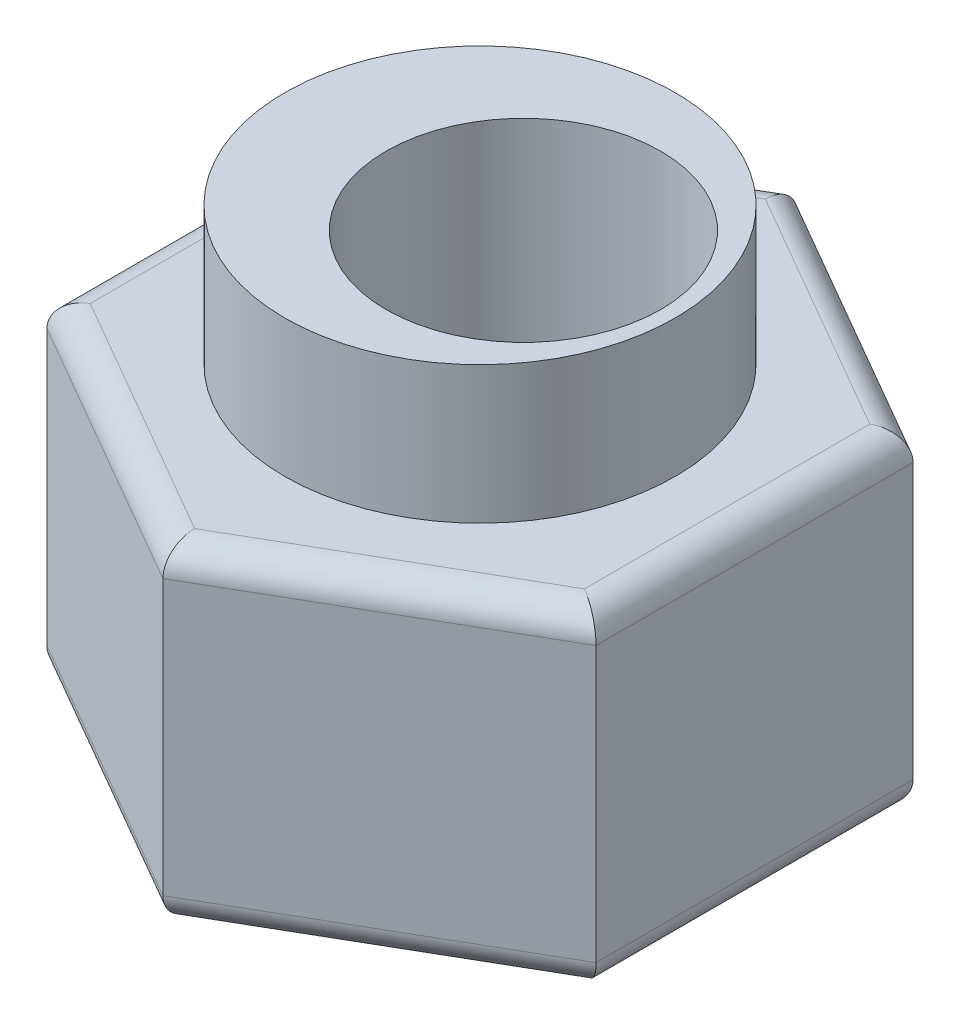
ISO-10303-21;
HEADER;
FILE_DESCRIPTION(('STEP AP214'),'2;1');
FILE_NAME('part.step','',(''),(''),'','','');
FILE_SCHEMA(('AUTOMOTIVE_DESIGN { 1 0 10303 214 1 1 1 1 }'));
ENDSEC;
DATA;
#1=APPLICATION_CONTEXT('core data for automotive mechanical design processes');
#2=APPLICATION_PROTOCOL_DEFINITION('international standard','automotive_design',2000,#1);
#3=PRODUCT_CONTEXT('',#1,'mechanical');
#4=PRODUCT('Part','Part','',(#3));
#5=PRODUCT_RELATED_PRODUCT_CATEGORY('part','',(#4));
#6=PRODUCT_DEFINITION_FORMATION('','',#4);
#7=PRODUCT_DEFINITION_CONTEXT('part definition',#1,'design');
#8=PRODUCT_DEFINITION('design','',#6,#7);
#9=PRODUCT_DEFINITION_SHAPE('','',#8);
#10=(LENGTH_UNIT() NAMED_UNIT(*) SI_UNIT(.MILLI.,.METRE.));
#11=(NAMED_UNIT(*) PLANE_ANGLE_UNIT() SI_UNIT($,.RADIAN.));
#12=(NAMED_UNIT(*) SI_UNIT($,.STERADIAN.) SOLID_ANGLE_UNIT());
#13=UNCERTAINTY_MEASURE_WITH_UNIT(LENGTH_MEASURE(1.E-05),#10,'distance_accuracy_value','');
#14=(GEOMETRIC_REPRESENTATION_CONTEXT(3) GLOBAL_UNCERTAINTY_ASSIGNED_CONTEXT((#13)) GLOBAL_UNIT_ASSIGNED_CONTEXT((#10,
#11,#12)) REPRESENTATION_CONTEXT('',''));
#15=CARTESIAN_POINT('',(0.,0.,0.));
#16=DIRECTION('',(0.,0.,1.));
#17=DIRECTION('',(1.,0.,0.));
#18=AXIS2_PLACEMENT_3D('',#15,#16,#17);
#19=CARTESIAN_POINT('',(0.,6.,5.77350269189626));
#20=DIRECTION('',(-0.5,0.,-0.866025403784439));
#21=DIRECTION('',(-0.866025403784439,0.,0.5));
#22=AXIS2_PLACEMENT_3D('',#19,#20,#21);
#23=PLANE('',#22);
#24=DIRECTION('',(0.,-1.,0.));
#25=VECTOR('',#24,1.);
#26=CARTESIAN_POINT('',(0.,6.,5.77350269189626));
#27=LINE('',#26,#25);
#28=CARTESIAN_POINT('',(0.,5.5,5.77350269189626));
#29=VERTEX_POINT('',#28);
#30=CARTESIAN_POINT('',(0.,0.5,5.77350269189626));
#31=VERTEX_POINT('',#30);
#32=EDGE_CURVE('E166',#29,#31,#27,.T.);
#33=ORIENTED_EDGE('',*,*,#32,.T.);
#34=DIRECTION('',(0.866025403784439,0.,-0.5));
#35=VECTOR('',#34,1.);
#36=CARTESIAN_POINT('',(0.,0.5,5.77350269189626));
#37=LINE('',#36,#35);
#38=CARTESIAN_POINT('',(5.,0.5,2.88675134594813));
#39=VERTEX_POINT('',#38);
#40=EDGE_CURVE('E199',#31,#39,#37,.T.);
#41=ORIENTED_EDGE('',*,*,#40,.T.);
#42=DIRECTION('',(0.,-1.,0.));
#43=VECTOR('',#42,1.);
#44=CARTESIAN_POINT('',(5.,6.,2.88675134594813));
#45=LINE('',#44,#43);
#46=CARTESIAN_POINT('',(5.,5.5,2.88675134594813));
#47=VERTEX_POINT('',#46);
#48=EDGE_CURVE('E172',#47,#39,#45,.T.);
#49=ORIENTED_EDGE('',*,*,#48,.F.);
#50=DIRECTION('',(0.866025403784439,0.,-0.5));
#51=VECTOR('',#50,1.);
#52=CARTESIAN_POINT('',(0.,5.5,5.77350269189626));
#53=LINE('',#52,#51);
#54=EDGE_CURVE('E197',#47,#29,#53,.F.);
#55=ORIENTED_EDGE('',*,*,#54,.T.);
#56=EDGE_LOOP('',(#33,#41,#49,#55));
#57=FACE_BOUND('',#56,.T.);
#58=ADVANCED_FACE('F39',(#57),#23,.F.);
#59=CARTESIAN_POINT('',(5.,6.,2.88675134594813));
#60=DIRECTION('',(-1.,0.,0.));
#61=DIRECTION('',(0.,0.,1.));
#62=AXIS2_PLACEMENT_3D('',#59,#60,#61);
#63=PLANE('',#62);
#64=ORIENTED_EDGE('',*,*,#48,.T.);
#65=DIRECTION('',(0.,0.,-1.));
#66=VECTOR('',#65,1.);
#67=CARTESIAN_POINT('',(5.,0.5,2.88675134594813));
#68=LINE('',#67,#66);
#69=CARTESIAN_POINT('',(5.,0.5,-2.88675134594813));
#70=VERTEX_POINT('',#69);
#71=EDGE_CURVE('E195',#39,#70,#68,.T.);
#72=ORIENTED_EDGE('',*,*,#71,.T.);
#73=DIRECTION('',(0.,-1.,0.));
#74=VECTOR('',#73,1.);
#75=CARTESIAN_POINT('',(5.,6.,-2.88675134594813));
#76=LINE('',#75,#74);
#77=CARTESIAN_POINT('',(5.,5.5,-2.88675134594813));
#78=VERTEX_POINT('',#77);
#79=EDGE_CURVE('E164',#78,#70,#76,.T.);
#80=ORIENTED_EDGE('',*,*,#79,.F.);
#81=DIRECTION('',(0.,0.,-1.));
#82=VECTOR('',#81,1.);
#83=CARTESIAN_POINT('',(5.,5.5,2.88675134594813));
#84=LINE('',#83,#82);
#85=EDGE_CURVE('E193',#78,#47,#84,.F.);
#86=ORIENTED_EDGE('',*,*,#85,.T.);
#87=EDGE_LOOP('',(#64,#72,#80,#86));
#88=FACE_BOUND('',#87,.T.);
#89=ADVANCED_FACE('F250',(#88),#63,.F.);
#90=CARTESIAN_POINT('',(5.,6.,-2.88675134594813));
#91=DIRECTION('',(-0.5,0.,0.866025403784439));
#92=DIRECTION('',(0.866025403784439,0.,0.5));
#93=AXIS2_PLACEMENT_3D('',#90,#91,#92);
#94=PLANE('',#93);
#95=ORIENTED_EDGE('',*,*,#79,.T.);
#96=DIRECTION('',(-0.866025403784439,0.,-0.5));
#97=VECTOR('',#96,1.);
#98=CARTESIAN_POINT('',(5.,0.5,-2.88675134594813));
#99=LINE('',#98,#97);
#100=CARTESIAN_POINT('',(0.,0.5,-5.77350269189626));
#101=VERTEX_POINT('',#100);
#102=EDGE_CURVE('E191',#70,#101,#99,.T.);
#103=ORIENTED_EDGE('',*,*,#102,.T.);
#104=DIRECTION('',(0.,-1.,0.));
#105=VECTOR('',#104,1.);
#106=CARTESIAN_POINT('',(0.,6.,-5.77350269189626));
#107=LINE('',#106,#105);
#108=CARTESIAN_POINT('',(0.,5.5,-5.77350269189626));
#109=VERTEX_POINT('',#108);
#110=EDGE_CURVE('E162',#109,#101,#107,.T.);
#111=ORIENTED_EDGE('',*,*,#110,.F.);
#112=DIRECTION('',(-0.866025403784439,0.,-0.5));
#113=VECTOR('',#112,1.);
#114=CARTESIAN_POINT('',(5.,5.5,-2.88675134594813));
#115=LINE('',#114,#113);
#116=EDGE_CURVE('E189',#109,#78,#115,.F.);
#117=ORIENTED_EDGE('',*,*,#116,.T.);
#118=EDGE_LOOP('',(#95,#103,#111,#117));
#119=FACE_BOUND('',#118,.T.);
#120=ADVANCED_FACE('F277',(#119),#94,.F.);
#121=CARTESIAN_POINT('',(0.,6.,-5.77350269189626));
#122=DIRECTION('',(0.5,0.,0.866025403784439));
#123=DIRECTION('',(0.866025403784439,0.,-0.5));
#124=AXIS2_PLACEMENT_3D('',#121,#122,#123);
#125=PLANE('',#124);
#126=ORIENTED_EDGE('',*,*,#110,.T.);
#127=DIRECTION('',(-0.866025403784439,0.,0.5));
#128=VECTOR('',#127,1.);
#129=CARTESIAN_POINT('',(0.,0.5,-5.77350269189626));
#130=LINE('',#129,#128);
#131=CARTESIAN_POINT('',(-5.,0.5,-2.88675134594813));
#132=VERTEX_POINT('',#131);
#133=EDGE_CURVE('E146',#101,#132,#130,.T.);
#134=ORIENTED_EDGE('',*,*,#133,.T.);
#135=DIRECTION('',(0.,-1.,0.));
#136=VECTOR('',#135,1.);
#137=CARTESIAN_POINT('',(-5.,6.,-2.88675134594813));
#138=LINE('',#137,#136);
#139=CARTESIAN_POINT('',(-5.,5.5,-2.88675134594813));
#140=VERTEX_POINT('',#139);
#141=EDGE_CURVE('E153',#140,#132,#138,.T.);
#142=ORIENTED_EDGE('',*,*,#141,.F.);
#143=DIRECTION('',(-0.866025403784439,0.,0.5));
#144=VECTOR('',#143,1.);
#145=CARTESIAN_POINT('',(0.,5.5,-5.77350269189626));
#146=LINE('',#145,#144);
#147=EDGE_CURVE('E139',#140,#109,#146,.F.);
#148=ORIENTED_EDGE('',*,*,#147,.T.);
#149=EDGE_LOOP('',(#126,#134,#142,#148));
#150=FACE_BOUND('',#149,.T.);
#151=ADVANCED_FACE('F160',(#150),#125,.F.);
#152=CARTESIAN_POINT('',(-5.,6.,-2.88675134594813));
#153=DIRECTION('',(1.,0.,0.));
#154=DIRECTION('',(0.,0.,-1.));
#155=AXIS2_PLACEMENT_3D('',#152,#153,#154);
#156=PLANE('',#155);
#157=ORIENTED_EDGE('',*,*,#141,.T.);
#158=DIRECTION('',(0.,0.,1.));
#159=VECTOR('',#158,1.);
#160=CARTESIAN_POINT('',(-5.,0.5,-2.88675134594813));
#161=LINE('',#160,#159);
#162=CARTESIAN_POINT('',(-5.,0.5,2.88675134594813));
#163=VERTEX_POINT('',#162);
#164=EDGE_CURVE('E156',#132,#163,#161,.T.);
#165=ORIENTED_EDGE('',*,*,#164,.T.);
#166=DIRECTION('',(0.,-1.,0.));
#167=VECTOR('',#166,1.);
#168=CARTESIAN_POINT('',(-5.,6.,2.88675134594813));
#169=LINE('',#168,#167);
#170=CARTESIAN_POINT('',(-5.,5.5,2.88675134594813));
#171=VERTEX_POINT('',#170);
#172=EDGE_CURVE('E155',#171,#163,#169,.T.);
#173=ORIENTED_EDGE('',*,*,#172,.F.);
#174=DIRECTION('',(0.,0.,1.));
#175=VECTOR('',#174,1.);
#176=CARTESIAN_POINT('',(-5.,5.5,-2.88675134594813));
#177=LINE('',#176,#175);
#178=EDGE_CURVE('E132',#171,#140,#177,.F.);
#179=ORIENTED_EDGE('',*,*,#178,.T.);
#180=EDGE_LOOP('',(#157,#165,#173,#179));
#181=FACE_BOUND('',#180,.T.);
#182=ADVANCED_FACE('F152',(#181),#156,.F.);
#183=CARTESIAN_POINT('',(-5.,6.,2.88675134594813));
#184=DIRECTION('',(0.5,0.,-0.866025403784439));
#185=DIRECTION('',(-0.866025403784439,0.,-0.5));
#186=AXIS2_PLACEMENT_3D('',#183,#184,#185);
#187=PLANE('',#186);
#188=ORIENTED_EDGE('',*,*,#172,.T.);
#189=DIRECTION('',(0.866025403784439,0.,0.5));
#190=VECTOR('',#189,1.);
#191=CARTESIAN_POINT('',(-5.,0.5,2.88675134594813));
#192=LINE('',#191,#190);
#193=EDGE_CURVE('E157',#163,#31,#192,.T.);
#194=ORIENTED_EDGE('',*,*,#193,.T.);
#195=ORIENTED_EDGE('',*,*,#32,.F.);
#196=DIRECTION('',(0.866025403784439,0.,0.5));
#197=VECTOR('',#196,1.);
#198=CARTESIAN_POINT('',(-5.,5.5,2.88675134594813));
#199=LINE('',#198,#197);
#200=EDGE_CURVE('E201',#29,#171,#199,.F.);
#201=ORIENTED_EDGE('',*,*,#200,.T.);
#202=EDGE_LOOP('',(#188,#194,#195,#201));
#203=FACE_BOUND('',#202,.T.);
#204=ADVANCED_FACE('F289',(#203),#187,.F.);
#205=CARTESIAN_POINT('',(0.,6.,0.));
#206=DIRECTION('',(0.,1.,0.));
#207=DIRECTION('',(0.,0.,1.));
#208=AXIS2_PLACEMENT_3D('',#205,#206,#207);
#209=PLANE('',#208);
#210=DIRECTION('',(-0.866025403784439,0.,0.5));
#211=VECTOR('',#210,1.);
#212=CARTESIAN_POINT('',(-4.75,6.,-2.45373864405591));
#213=LINE('',#212,#211);
#214=CARTESIAN_POINT('',(0.,6.,-5.19615242270663));
#215=VERTEX_POINT('',#214);
#216=CARTESIAN_POINT('',(-4.5,6.,-2.59807621135332));
#217=VERTEX_POINT('',#216);
#218=EDGE_CURVE('E48',#215,#217,#213,.T.);
#219=ORIENTED_EDGE('',*,*,#218,.T.);
#220=DIRECTION('',(0.,0.,1.));
#221=VECTOR('',#220,1.);
#222=CARTESIAN_POINT('',(-4.5,6.,2.88675134594813));
#223=LINE('',#222,#221);
#224=CARTESIAN_POINT('',(-4.5,6.,2.59807621135332));
#225=VERTEX_POINT('',#224);
#226=EDGE_CURVE('E11',#217,#225,#223,.T.);
#227=ORIENTED_EDGE('',*,*,#226,.T.);
#228=DIRECTION('',(0.866025403784439,0.,0.5));
#229=VECTOR('',#228,1.);
#230=CARTESIAN_POINT('',(0.250000000000001,6.,5.34048999000404));
#231=LINE('',#230,#229);
#232=CARTESIAN_POINT('',(0.,6.,5.19615242270663));
#233=VERTEX_POINT('',#232);
#234=EDGE_CURVE('E205',#225,#233,#231,.T.);
#235=ORIENTED_EDGE('',*,*,#234,.T.);
#236=DIRECTION('',(0.866025403784439,0.,-0.5));
#237=VECTOR('',#236,1.);
#238=CARTESIAN_POINT('',(4.75,6.,2.45373864405591));
#239=LINE('',#238,#237);
#240=CARTESIAN_POINT('',(4.5,6.,2.59807621135332));
#241=VERTEX_POINT('',#240);
#242=EDGE_CURVE('E207',#233,#241,#239,.T.);
#243=ORIENTED_EDGE('',*,*,#242,.T.);
#244=DIRECTION('',(0.,0.,-1.));
#245=VECTOR('',#244,1.);
#246=CARTESIAN_POINT('',(4.5,6.,-2.88675134594813));
#247=LINE('',#246,#245);
#248=CARTESIAN_POINT('',(4.5,6.,-2.59807621135332));
#249=VERTEX_POINT('',#248);
#250=EDGE_CURVE('E209',#241,#249,#247,.T.);
#251=ORIENTED_EDGE('',*,*,#250,.T.);
#252=DIRECTION('',(-0.866025403784439,0.,-0.5));
#253=VECTOR('',#252,1.);
#254=CARTESIAN_POINT('',(-0.250000000000001,6.,-5.34048999000404));
#255=LINE('',#254,#253);
#256=EDGE_CURVE('E59',#249,#215,#255,.T.);
#257=ORIENTED_EDGE('',*,*,#256,.T.);
#258=EDGE_LOOP('',(#219,#227,#235,#243,#251,#257));
#259=FACE_BOUND('',#258,.T.);
#260=CARTESIAN_POINT('',(0.,6.,0.));
#261=DIRECTION('',(0.,1.,0.));
#262=DIRECTION('',(0.,0.,1.));
#263=AXIS2_PLACEMENT_3D('',#260,#261,#262);
#264=CIRCLE('',#263,3.555);
#265=CARTESIAN_POINT('',(0.,6.,3.555));
#266=VERTEX_POINT('',#265);
#267=EDGE_CURVE('E147',#266,#266,#264,.T.);
#268=ORIENTED_EDGE('',*,*,#267,.F.);
#269=EDGE_LOOP('',(#268));
#270=FACE_BOUND('',#269,.T.);
#271=ADVANCED_FACE('F295',(#259,#270),#209,.T.);
#272=CARTESIAN_POINT('',(0.,0.,0.));
#273=DIRECTION('',(0.,1.,0.));
#274=DIRECTION('',(0.,0.,1.));
#275=AXIS2_PLACEMENT_3D('',#272,#273,#274);
#276=PLANE('',#275);
#277=DIRECTION('',(0.,0.,1.));
#278=VECTOR('',#277,1.);
#279=CARTESIAN_POINT('',(-4.5,0.,0.));
#280=LINE('',#279,#278);
#281=CARTESIAN_POINT('',(-4.5,0.,2.59807621135332));
#282=VERTEX_POINT('',#281);
#283=CARTESIAN_POINT('',(-4.5,0.,-2.59807621135332));
#284=VERTEX_POINT('',#283);
#285=EDGE_CURVE('E176',#282,#284,#280,.F.);
#286=ORIENTED_EDGE('',*,*,#285,.T.);
#287=DIRECTION('',(-0.866025403784439,0.,0.5));
#288=VECTOR('',#287,1.);
#289=CARTESIAN_POINT('',(-2.25,0.,-3.89711431702998));
#290=LINE('',#289,#288);
#291=CARTESIAN_POINT('',(0.,0.,-5.19615242270663));
#292=VERTEX_POINT('',#291);
#293=EDGE_CURVE('E186',#284,#292,#290,.F.);
#294=ORIENTED_EDGE('',*,*,#293,.T.);
#295=DIRECTION('',(-0.866025403784439,0.,-0.5));
#296=VECTOR('',#295,1.);
#297=CARTESIAN_POINT('',(2.25,0.,-3.89711431702997));
#298=LINE('',#297,#296);
#299=CARTESIAN_POINT('',(4.5,0.,-2.59807621135332));
#300=VERTEX_POINT('',#299);
#301=EDGE_CURVE('E184',#292,#300,#298,.F.);
#302=ORIENTED_EDGE('',*,*,#301,.T.);
#303=DIRECTION('',(0.,0.,-1.));
#304=VECTOR('',#303,1.);
#305=CARTESIAN_POINT('',(4.5,0.,0.));
#306=LINE('',#305,#304);
#307=CARTESIAN_POINT('',(4.5,0.,2.59807621135332));
#308=VERTEX_POINT('',#307);
#309=EDGE_CURVE('E182',#300,#308,#306,.F.);
#310=ORIENTED_EDGE('',*,*,#309,.T.);
#311=DIRECTION('',(0.866025403784439,0.,-0.5));
#312=VECTOR('',#311,1.);
#313=CARTESIAN_POINT('',(2.25,0.,3.89711431702997));
#314=LINE('',#313,#312);
#315=CARTESIAN_POINT('',(0.,0.,5.19615242270663));
#316=VERTEX_POINT('',#315);
#317=EDGE_CURVE('E180',#308,#316,#314,.F.);
#318=ORIENTED_EDGE('',*,*,#317,.T.);
#319=DIRECTION('',(0.866025403784439,0.,0.5));
#320=VECTOR('',#319,1.);
#321=CARTESIAN_POINT('',(-2.25,0.,3.89711431702997));
#322=LINE('',#321,#320);
#323=EDGE_CURVE('E178',#316,#282,#322,.F.);
#324=ORIENTED_EDGE('',*,*,#323,.T.);
#325=EDGE_LOOP('',(#286,#294,#302,#310,#318,#324));
#326=FACE_BOUND('',#325,.T.);
#327=CARTESIAN_POINT('',(0.79,0.,0.));
#328=DIRECTION('',(0.,1.,0.));
#329=DIRECTION('',(0.,0.,1.));
#330=AXIS2_PLACEMENT_3D('',#327,#328,#329);
#331=CIRCLE('',#330,2.5);
#332=CARTESIAN_POINT('',(0.79,0.,2.5));
#333=VERTEX_POINT('',#332);
#334=EDGE_CURVE('E307',#333,#333,#331,.T.);
#335=ORIENTED_EDGE('',*,*,#334,.T.);
#336=EDGE_LOOP('',(#335));
#337=FACE_BOUND('',#336,.T.);
#338=ADVANCED_FACE('F268',(#326,#337),#276,.F.);
#339=CARTESIAN_POINT('',(0.,8.5,0.));
#340=DIRECTION('',(0.,-1.,0.));
#341=DIRECTION('',(0.,0.,-1.));
#342=AXIS2_PLACEMENT_3D('',#339,#340,#341);
#343=CYLINDRICAL_SURFACE('',#342,3.555);
#344=CARTESIAN_POINT('',(0.,8.5,0.));
#345=DIRECTION('',(0.,1.,0.));
#346=DIRECTION('',(0.,0.,1.));
#347=AXIS2_PLACEMENT_3D('',#344,#345,#346);
#348=CIRCLE('',#347,3.555);
#349=CARTESIAN_POINT('',(0.,8.5,3.555));
#350=VERTEX_POINT('',#349);
#351=EDGE_CURVE('E304',#350,#350,#348,.T.);
#352=ORIENTED_EDGE('',*,*,#351,.F.);
#353=EDGE_LOOP('',(#352));
#354=FACE_BOUND('',#353,.T.);
#355=ORIENTED_EDGE('',*,*,#267,.T.);
#356=EDGE_LOOP('',(#355));
#357=FACE_BOUND('',#356,.T.);
#358=ADVANCED_FACE('F320',(#354,#357),#343,.T.);
#359=CARTESIAN_POINT('',(0.,8.5,0.));
#360=DIRECTION('',(0.,1.,0.));
#361=DIRECTION('',(0.,0.,1.));
#362=AXIS2_PLACEMENT_3D('',#359,#360,#361);
#363=PLANE('',#362);
#364=CARTESIAN_POINT('',(0.79,8.5,0.));
#365=DIRECTION('',(0.,1.,0.));
#366=DIRECTION('',(0.,0.,1.));
#367=AXIS2_PLACEMENT_3D('',#364,#365,#366);
#368=CIRCLE('',#367,2.5);
#369=CARTESIAN_POINT('',(0.79,8.5,2.5));
#370=VERTEX_POINT('',#369);
#371=EDGE_CURVE('E229',#370,#370,#368,.T.);
#372=ORIENTED_EDGE('',*,*,#371,.F.);
#373=EDGE_LOOP('',(#372));
#374=FACE_BOUND('',#373,.T.);
#375=ORIENTED_EDGE('',*,*,#351,.T.);
#376=EDGE_LOOP('',(#375));
#377=FACE_BOUND('',#376,.T.);
#378=ADVANCED_FACE('F318',(#374,#377),#363,.T.);
#379=CARTESIAN_POINT('',(0.79,0.,0.));
#380=DIRECTION('',(0.,1.,0.));
#381=DIRECTION('',(0.,0.,1.));
#382=AXIS2_PLACEMENT_3D('',#379,#380,#381);
#383=CYLINDRICAL_SURFACE('',#382,2.5);
#384=ORIENTED_EDGE('',*,*,#334,.F.);
#385=EDGE_LOOP('',(#384));
#386=FACE_BOUND('',#385,.T.);
#387=ORIENTED_EDGE('',*,*,#371,.T.);
#388=EDGE_LOOP('',(#387));
#389=FACE_BOUND('',#388,.T.);
#390=ADVANCED_FACE('F316',(#386,#389),#383,.F.);
#391=CARTESIAN_POINT('',(-0.25,0.5,5.34048999000404));
#392=DIRECTION('',(0.866025403784439,0.,-0.5));
#393=DIRECTION('',(-0.5,0.,-0.866025403784439));
#394=AXIS2_PLACEMENT_3D('',#391,#392,#393);
#395=CYLINDRICAL_SURFACE('',#394,0.5);
#396=CARTESIAN_POINT('',(0.,0.5,5.19615242270663));
#397=DIRECTION('',(1.,0.,0.));
#398=DIRECTION('',(0.,0.,1.));
#399=AXIS2_PLACEMENT_3D('',#396,#397,#398);
#400=ELLIPSE('',#399,0.577350269189626,0.5);
#401=EDGE_CURVE('E223',#316,#31,#400,.F.);
#402=ORIENTED_EDGE('',*,*,#401,.F.);
#403=ORIENTED_EDGE('',*,*,#317,.F.);
#404=CARTESIAN_POINT('',(4.5,0.5,2.59807621135332));
#405=DIRECTION('',(0.5,0.,-0.866025403784439));
#406=DIRECTION('',(0.866025403784439,0.,0.5));
#407=AXIS2_PLACEMENT_3D('',#404,#405,#406);
#408=ELLIPSE('',#407,0.577350269189626,0.5);
#409=EDGE_CURVE('E226',#39,#308,#408,.T.);
#410=ORIENTED_EDGE('',*,*,#409,.F.);
#411=ORIENTED_EDGE('',*,*,#40,.F.);
#412=EDGE_LOOP('',(#402,#403,#410,#411));
#413=FACE_BOUND('',#412,.T.);
#414=ADVANCED_FACE('F258',(#413),#395,.T.);
#415=CARTESIAN_POINT('',(4.5,0.5,2.88675134594813));
#416=DIRECTION('',(0.,0.,-1.));
#417=DIRECTION('',(-1.,0.,0.));
#418=AXIS2_PLACEMENT_3D('',#415,#416,#417);
#419=CYLINDRICAL_SURFACE('',#418,0.5);
#420=ORIENTED_EDGE('',*,*,#409,.T.);
#421=ORIENTED_EDGE('',*,*,#309,.F.);
#422=CARTESIAN_POINT('',(4.5,0.5,-2.59807621135332));
#423=DIRECTION('',(-0.5,0.,-0.866025403784439));
#424=DIRECTION('',(0.866025403784439,0.,-0.5));
#425=AXIS2_PLACEMENT_3D('',#422,#423,#424);
#426=ELLIPSE('',#425,0.577350269189626,0.5);
#427=EDGE_CURVE('E220',#70,#300,#426,.T.);
#428=ORIENTED_EDGE('',*,*,#427,.F.);
#429=ORIENTED_EDGE('',*,*,#71,.F.);
#430=EDGE_LOOP('',(#420,#421,#428,#429));
#431=FACE_BOUND('',#430,.T.);
#432=ADVANCED_FACE('F273',(#431),#419,.T.);
#433=CARTESIAN_POINT('',(-4.75,0.5,2.45373864405591));
#434=DIRECTION('',(0.866025403784439,0.,0.5));
#435=DIRECTION('',(0.5,0.,-0.866025403784439));
#436=AXIS2_PLACEMENT_3D('',#433,#434,#435);
#437=CYLINDRICAL_SURFACE('',#436,0.5);
#438=ORIENTED_EDGE('',*,*,#401,.T.);
#439=ORIENTED_EDGE('',*,*,#193,.F.);
#440=CARTESIAN_POINT('',(-4.5,0.5,2.59807621135332));
#441=DIRECTION('',(0.5,0.,0.866025403784439));
#442=DIRECTION('',(-0.866025403784439,0.,0.5));
#443=AXIS2_PLACEMENT_3D('',#440,#441,#442);
#444=ELLIPSE('',#443,0.577350269189626,0.5);
#445=EDGE_CURVE('E217',#282,#163,#444,.F.);
#446=ORIENTED_EDGE('',*,*,#445,.F.);
#447=ORIENTED_EDGE('',*,*,#323,.F.);
#448=EDGE_LOOP('',(#438,#439,#446,#447));
#449=FACE_BOUND('',#448,.T.);
#450=ADVANCED_FACE('F264',(#449),#437,.T.);
#451=CARTESIAN_POINT('',(4.75,0.5,-2.45373864405591));
#452=DIRECTION('',(-0.866025403784439,0.,-0.5));
#453=DIRECTION('',(-0.5,0.,0.866025403784439));
#454=AXIS2_PLACEMENT_3D('',#451,#452,#453);
#455=CYLINDRICAL_SURFACE('',#454,0.5);
#456=ORIENTED_EDGE('',*,*,#427,.T.);
#457=ORIENTED_EDGE('',*,*,#301,.F.);
#458=CARTESIAN_POINT('',(0.,0.5,-5.19615242270663));
#459=DIRECTION('',(-1.,0.,0.));
#460=DIRECTION('',(0.,0.,-1.));
#461=AXIS2_PLACEMENT_3D('',#458,#459,#460);
#462=ELLIPSE('',#461,0.577350269189626,0.5);
#463=EDGE_CURVE('E215',#101,#292,#462,.T.);
#464=ORIENTED_EDGE('',*,*,#463,.F.);
#465=ORIENTED_EDGE('',*,*,#102,.F.);
#466=EDGE_LOOP('',(#456,#457,#464,#465));
#467=FACE_BOUND('',#466,.T.);
#468=ADVANCED_FACE('F281',(#467),#455,.T.);
#469=CARTESIAN_POINT('',(-4.5,0.5,-2.88675134594813));
#470=DIRECTION('',(0.,0.,1.));
#471=DIRECTION('',(1.,0.,0.));
#472=AXIS2_PLACEMENT_3D('',#469,#470,#471);
#473=CYLINDRICAL_SURFACE('',#472,0.5);
#474=ORIENTED_EDGE('',*,*,#445,.T.);
#475=ORIENTED_EDGE('',*,*,#164,.F.);
#476=CARTESIAN_POINT('',(-4.5,0.5,-2.59807621135332));
#477=DIRECTION('',(-0.5,0.,0.866025403784439));
#478=DIRECTION('',(0.866025403784439,0.,0.5));
#479=AXIS2_PLACEMENT_3D('',#476,#477,#478);
#480=ELLIPSE('',#479,0.577350269189626,0.5);
#481=EDGE_CURVE('E213',#284,#132,#480,.F.);
#482=ORIENTED_EDGE('',*,*,#481,.F.);
#483=ORIENTED_EDGE('',*,*,#285,.F.);
#484=EDGE_LOOP('',(#474,#475,#482,#483));
#485=FACE_BOUND('',#484,.T.);
#486=ADVANCED_FACE('F287',(#485),#473,.T.);
#487=CARTESIAN_POINT('',(0.249999999999999,0.5,-5.34048999000404));
#488=DIRECTION('',(-0.866025403784439,0.,0.5));
#489=DIRECTION('',(0.5,0.,0.866025403784439));
#490=AXIS2_PLACEMENT_3D('',#487,#488,#489);
#491=CYLINDRICAL_SURFACE('',#490,0.5);
#492=ORIENTED_EDGE('',*,*,#463,.T.);
#493=ORIENTED_EDGE('',*,*,#293,.F.);
#494=ORIENTED_EDGE('',*,*,#481,.T.);
#495=ORIENTED_EDGE('',*,*,#133,.F.);
#496=EDGE_LOOP('',(#492,#493,#494,#495));
#497=FACE_BOUND('',#496,.T.);
#498=ADVANCED_FACE('F283',(#497),#491,.T.);
#499=CARTESIAN_POINT('',(4.5,5.5,0.));
#500=DIRECTION('',(0.,0.,1.));
#501=DIRECTION('',(1.,0.,0.));
#502=AXIS2_PLACEMENT_3D('',#499,#500,#501);
#503=CYLINDRICAL_SURFACE('',#502,0.5);
#504=CARTESIAN_POINT('',(4.5,5.5,2.59807621135332));
#505=DIRECTION('',(-0.5,0.,0.866025403784439));
#506=DIRECTION('',(-0.866025403784439,0.,-0.5));
#507=AXIS2_PLACEMENT_3D('',#504,#505,#506);
#508=ELLIPSE('',#507,0.577350269189626,0.5);
#509=EDGE_CURVE('E233',#47,#241,#508,.T.);
#510=ORIENTED_EDGE('',*,*,#509,.F.);
#511=ORIENTED_EDGE('',*,*,#85,.F.);
#512=CARTESIAN_POINT('',(4.5,5.5,-2.59807621135332));
#513=DIRECTION('',(0.5,0.,0.866025403784439));
#514=DIRECTION('',(-0.866025403784439,0.,0.5));
#515=AXIS2_PLACEMENT_3D('',#512,#513,#514);
#516=ELLIPSE('',#515,0.577350269189626,0.5);
#517=EDGE_CURVE('E43',#249,#78,#516,.F.);
#518=ORIENTED_EDGE('',*,*,#517,.F.);
#519=ORIENTED_EDGE('',*,*,#250,.F.);
#520=EDGE_LOOP('',(#510,#511,#518,#519));
#521=FACE_BOUND('',#520,.T.);
#522=ADVANCED_FACE('F41',(#521),#503,.T.);
#523=CARTESIAN_POINT('',(2.25,5.5,-3.89711431702998));
#524=DIRECTION('',(0.866025403784439,0.,0.5));
#525=DIRECTION('',(0.5,0.,-0.866025403784439));
#526=AXIS2_PLACEMENT_3D('',#523,#524,#525);
#527=CYLINDRICAL_SURFACE('',#526,0.5);
#528=ORIENTED_EDGE('',*,*,#517,.T.);
#529=ORIENTED_EDGE('',*,*,#116,.F.);
#530=CARTESIAN_POINT('',(0.,5.5,-5.19615242270663));
#531=DIRECTION('',(1.,0.,0.));
#532=DIRECTION('',(0.,0.,1.));
#533=AXIS2_PLACEMENT_3D('',#530,#531,#532);
#534=ELLIPSE('',#533,0.577350269189626,0.5);
#535=EDGE_CURVE('E141',#215,#109,#534,.F.);
#536=ORIENTED_EDGE('',*,*,#535,.F.);
#537=ORIENTED_EDGE('',*,*,#256,.F.);
#538=EDGE_LOOP('',(#528,#529,#536,#537));
#539=FACE_BOUND('',#538,.T.);
#540=ADVANCED_FACE('F243',(#539),#527,.T.);
#541=CARTESIAN_POINT('',(2.25,5.5,3.89711431702997));
#542=DIRECTION('',(-0.866025403784439,0.,0.5));
#543=DIRECTION('',(0.5,0.,0.866025403784439));
#544=AXIS2_PLACEMENT_3D('',#541,#542,#543);
#545=CYLINDRICAL_SURFACE('',#544,0.5);
#546=ORIENTED_EDGE('',*,*,#509,.T.);
#547=ORIENTED_EDGE('',*,*,#242,.F.);
#548=CARTESIAN_POINT('',(0.,5.5,5.19615242270663));
#549=DIRECTION('',(-1.,0.,0.));
#550=DIRECTION('',(0.,0.,-1.));
#551=AXIS2_PLACEMENT_3D('',#548,#549,#550);
#552=ELLIPSE('',#551,0.577350269189626,0.5);
#553=EDGE_CURVE('E135',#29,#233,#552,.T.);
#554=ORIENTED_EDGE('',*,*,#553,.F.);
#555=ORIENTED_EDGE('',*,*,#54,.F.);
#556=EDGE_LOOP('',(#546,#547,#554,#555));
#557=FACE_BOUND('',#556,.T.);
#558=ADVANCED_FACE('F356',(#557),#545,.T.);
#559=CARTESIAN_POINT('',(-2.25,5.5,-3.89711431702998));
#560=DIRECTION('',(0.866025403784439,0.,-0.5));
#561=DIRECTION('',(-0.5,0.,-0.866025403784439));
#562=AXIS2_PLACEMENT_3D('',#559,#560,#561);
#563=CYLINDRICAL_SURFACE('',#562,0.5);
#564=ORIENTED_EDGE('',*,*,#535,.T.);
#565=ORIENTED_EDGE('',*,*,#147,.F.);
#566=CARTESIAN_POINT('',(-4.5,5.5,-2.59807621135332));
#567=DIRECTION('',(0.5,0.,-0.866025403784439));
#568=DIRECTION('',(0.866025403784439,0.,0.5));
#569=AXIS2_PLACEMENT_3D('',#566,#567,#568);
#570=ELLIPSE('',#569,0.577350269189626,0.5);
#571=EDGE_CURVE('E128',#217,#140,#570,.F.);
#572=ORIENTED_EDGE('',*,*,#571,.F.);
#573=ORIENTED_EDGE('',*,*,#218,.F.);
#574=EDGE_LOOP('',(#564,#565,#572,#573));
#575=FACE_BOUND('',#574,.T.);
#576=ADVANCED_FACE('F140',(#575),#563,.T.);
#577=CARTESIAN_POINT('',(-2.25,5.5,3.89711431702997));
#578=DIRECTION('',(-0.866025403784439,0.,-0.5));
#579=DIRECTION('',(-0.5,0.,0.866025403784439));
#580=AXIS2_PLACEMENT_3D('',#577,#578,#579);
#581=CYLINDRICAL_SURFACE('',#580,0.5);
#582=ORIENTED_EDGE('',*,*,#553,.T.);
#583=ORIENTED_EDGE('',*,*,#234,.F.);
#584=CARTESIAN_POINT('',(-4.5,5.5,2.59807621135332));
#585=DIRECTION('',(-0.5,0.,-0.866025403784439));
#586=DIRECTION('',(-0.866025403784439,0.,0.5));
#587=AXIS2_PLACEMENT_3D('',#584,#585,#586);
#588=ELLIPSE('',#587,0.577350269189626,0.5);
#589=EDGE_CURVE('E136',#171,#225,#588,.T.);
#590=ORIENTED_EDGE('',*,*,#589,.F.);
#591=ORIENTED_EDGE('',*,*,#200,.F.);
#592=EDGE_LOOP('',(#582,#583,#590,#591));
#593=FACE_BOUND('',#592,.T.);
#594=ADVANCED_FACE('F293',(#593),#581,.T.);
#595=CARTESIAN_POINT('',(-4.5,5.5,0.));
#596=DIRECTION('',(0.,0.,-1.));
#597=DIRECTION('',(-1.,0.,0.));
#598=AXIS2_PLACEMENT_3D('',#595,#596,#597);
#599=CYLINDRICAL_SURFACE('',#598,0.5);
#600=ORIENTED_EDGE('',*,*,#571,.T.);
#601=ORIENTED_EDGE('',*,*,#178,.F.);
#602=ORIENTED_EDGE('',*,*,#589,.T.);
#603=ORIENTED_EDGE('',*,*,#226,.F.);
#604=EDGE_LOOP('',(#600,#601,#602,#603));
#605=FACE_BOUND('',#604,.T.);
#606=ADVANCED_FACE('F130',(#605),#599,.T.);
#607=CLOSED_SHELL('',(#58,#89,#120,#151,#182,#204,#271,#338,#358,#378,#390,#414,#432,#450,#468,
#486,#498,#522,#540,#558,#576,#594,#606));
#608=MANIFOLD_SOLID_BREP('B2',#607);
#609=ADVANCED_BREP_SHAPE_REPRESENTATION('',(#18,#608),#14);
#610=SHAPE_DEFINITION_REPRESENTATION(#9,#609);
ENDSEC;
END-ISO-10303-21;
